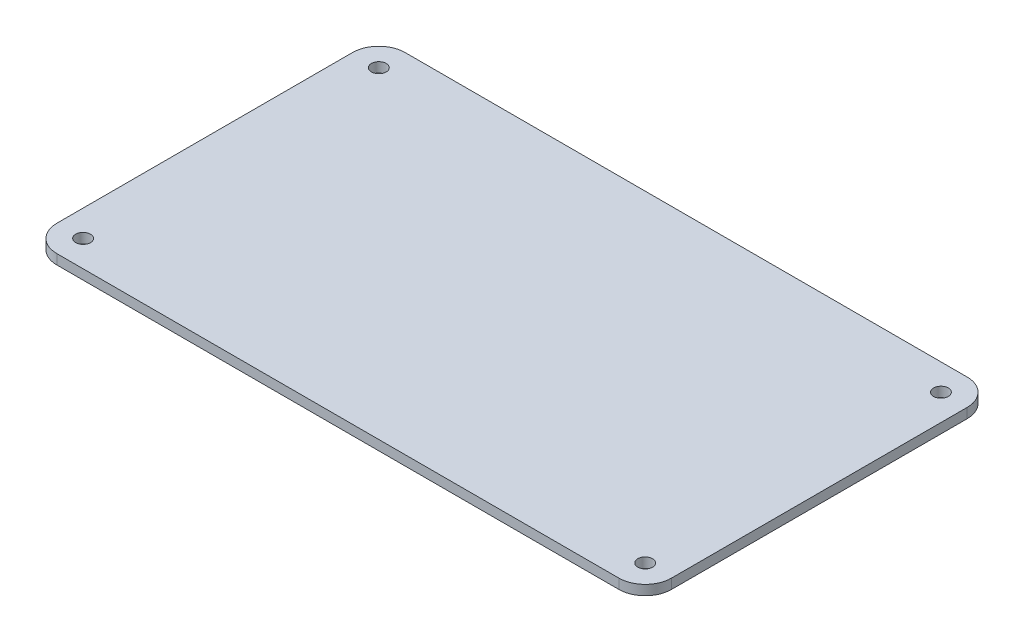
ISO-10303-21;
HEADER;
FILE_DESCRIPTION(('STEP AP214'),'2;1');
FILE_NAME('part.step','',(''),(''),'','','');
FILE_SCHEMA(('AUTOMOTIVE_DESIGN { 1 0 10303 214 1 1 1 1 }'));
ENDSEC;
DATA;
#1=APPLICATION_CONTEXT('core data for automotive mechanical design processes');
#2=APPLICATION_PROTOCOL_DEFINITION('international standard','automotive_design',2000,#1);
#3=PRODUCT_CONTEXT('',#1,'mechanical');
#4=PRODUCT('Part','Part','',(#3));
#5=PRODUCT_RELATED_PRODUCT_CATEGORY('part','',(#4));
#6=PRODUCT_DEFINITION_FORMATION('','',#4);
#7=PRODUCT_DEFINITION_CONTEXT('part definition',#1,'design');
#8=PRODUCT_DEFINITION('design','',#6,#7);
#9=PRODUCT_DEFINITION_SHAPE('','',#8);
#10=(LENGTH_UNIT() NAMED_UNIT(*) SI_UNIT(.MILLI.,.METRE.));
#11=(NAMED_UNIT(*) PLANE_ANGLE_UNIT() SI_UNIT($,.RADIAN.));
#12=(NAMED_UNIT(*) SI_UNIT($,.STERADIAN.) SOLID_ANGLE_UNIT());
#13=UNCERTAINTY_MEASURE_WITH_UNIT(LENGTH_MEASURE(1.E-05),#10,'distance_accuracy_value','');
#14=(GEOMETRIC_REPRESENTATION_CONTEXT(3) GLOBAL_UNCERTAINTY_ASSIGNED_CONTEXT((#13)) GLOBAL_UNIT_ASSIGNED_CONTEXT((#10,
#11,#12)) REPRESENTATION_CONTEXT('',''));
#15=CARTESIAN_POINT('',(0.,0.,0.));
#16=DIRECTION('',(0.,0.,1.));
#17=DIRECTION('',(1.,0.,0.));
#18=AXIS2_PLACEMENT_3D('',#15,#16,#17);
#19=CARTESIAN_POINT('',(0.,4.7625,142.88262));
#20=DIRECTION('',(0.,-1.,0.));
#21=DIRECTION('',(0.,0.,-1.));
#22=AXIS2_PLACEMENT_3D('',#19,#20,#21);
#23=CYLINDRICAL_SURFACE('',#22,12.7);
#24=CARTESIAN_POINT('',(0.,0.,142.88262));
#25=DIRECTION('',(0.,1.,0.));
#26=DIRECTION('',(0.,0.,1.));
#27=AXIS2_PLACEMENT_3D('',#24,#25,#26);
#28=CIRCLE('',#27,12.7);
#29=CARTESIAN_POINT('',(-12.7,0.,142.88262));
#30=VERTEX_POINT('',#29);
#31=CARTESIAN_POINT('',(0.,0.,155.58262));
#32=VERTEX_POINT('',#31);
#33=EDGE_CURVE('E144',#30,#32,#28,.T.);
#34=ORIENTED_EDGE('',*,*,#33,.T.);
#35=DIRECTION('',(0.,-1.,0.));
#36=VECTOR('',#35,1.);
#37=CARTESIAN_POINT('',(0.,4.7625,155.58262));
#38=LINE('',#37,#36);
#39=CARTESIAN_POINT('',(0.,4.7625,155.58262));
#40=VERTEX_POINT('',#39);
#41=EDGE_CURVE('E11',#40,#32,#38,.T.);
#42=ORIENTED_EDGE('',*,*,#41,.F.);
#43=CARTESIAN_POINT('',(0.,4.7625,142.88262));
#44=DIRECTION('',(0.,1.,0.));
#45=DIRECTION('',(0.,0.,1.));
#46=AXIS2_PLACEMENT_3D('',#43,#44,#45);
#47=CIRCLE('',#46,12.7);
#48=CARTESIAN_POINT('',(-12.7,4.7625,142.88262));
#49=VERTEX_POINT('',#48);
#50=EDGE_CURVE('E167',#49,#40,#47,.T.);
#51=ORIENTED_EDGE('',*,*,#50,.F.);
#52=DIRECTION('',(0.,-1.,0.));
#53=VECTOR('',#52,1.);
#54=CARTESIAN_POINT('',(-12.7,4.7625,142.88262));
#55=LINE('',#54,#53);
#56=EDGE_CURVE('E140',#49,#30,#55,.T.);
#57=ORIENTED_EDGE('',*,*,#56,.T.);
#58=EDGE_LOOP('',(#34,#42,#51,#57));
#59=FACE_BOUND('',#58,.T.);
#60=ADVANCED_FACE('F43',(#59),#23,.T.);
#61=CARTESIAN_POINT('',(0.,4.7625,155.58262));
#62=DIRECTION('',(0.,0.,-1.));
#63=DIRECTION('',(-1.,0.,0.));
#64=AXIS2_PLACEMENT_3D('',#61,#62,#63);
#65=PLANE('',#64);
#66=DIRECTION('',(1.,0.,0.));
#67=VECTOR('',#66,1.);
#68=CARTESIAN_POINT('',(0.,0.,155.58262));
#69=LINE('',#68,#67);
#70=CARTESIAN_POINT('',(271.58696,0.,155.58262));
#71=VERTEX_POINT('',#70);
#72=EDGE_CURVE('E148',#32,#71,#69,.T.);
#73=ORIENTED_EDGE('',*,*,#72,.T.);
#74=DIRECTION('',(0.,-1.,0.));
#75=VECTOR('',#74,1.);
#76=CARTESIAN_POINT('',(271.58696,4.7625,155.58262));
#77=LINE('',#76,#75);
#78=CARTESIAN_POINT('',(271.58696,4.7625,155.58262));
#79=VERTEX_POINT('',#78);
#80=EDGE_CURVE('E52',#79,#71,#77,.T.);
#81=ORIENTED_EDGE('',*,*,#80,.F.);
#82=DIRECTION('',(1.,0.,0.));
#83=VECTOR('',#82,1.);
#84=CARTESIAN_POINT('',(0.,4.7625,155.58262));
#85=LINE('',#84,#83);
#86=EDGE_CURVE('E103',#40,#79,#85,.T.);
#87=ORIENTED_EDGE('',*,*,#86,.F.);
#88=ORIENTED_EDGE('',*,*,#41,.T.);
#89=EDGE_LOOP('',(#73,#81,#87,#88));
#90=FACE_BOUND('',#89,.T.);
#91=ADVANCED_FACE('F271',(#90),#65,.F.);
#92=CARTESIAN_POINT('',(271.58696,4.7625,142.88262));
#93=DIRECTION('',(0.,-1.,0.));
#94=DIRECTION('',(0.,0.,-1.));
#95=AXIS2_PLACEMENT_3D('',#92,#93,#94);
#96=CYLINDRICAL_SURFACE('',#95,12.7);
#97=CARTESIAN_POINT('',(271.58696,0.,142.88262));
#98=DIRECTION('',(0.,1.,0.));
#99=DIRECTION('',(0.,0.,1.));
#100=AXIS2_PLACEMENT_3D('',#97,#98,#99);
#101=CIRCLE('',#100,12.7);
#102=CARTESIAN_POINT('',(284.28696,0.,142.88262));
#103=VERTEX_POINT('',#102);
#104=EDGE_CURVE('E152',#71,#103,#101,.T.);
#105=ORIENTED_EDGE('',*,*,#104,.T.);
#106=DIRECTION('',(0.,-1.,0.));
#107=VECTOR('',#106,1.);
#108=CARTESIAN_POINT('',(284.28696,4.7625,142.88262));
#109=LINE('',#108,#107);
#110=CARTESIAN_POINT('',(284.28696,4.7625,142.88262));
#111=VERTEX_POINT('',#110);
#112=EDGE_CURVE('E178',#111,#103,#109,.T.);
#113=ORIENTED_EDGE('',*,*,#112,.F.);
#114=CARTESIAN_POINT('',(271.58696,4.7625,142.88262));
#115=DIRECTION('',(0.,1.,0.));
#116=DIRECTION('',(0.,0.,1.));
#117=AXIS2_PLACEMENT_3D('',#114,#115,#116);
#118=CIRCLE('',#117,12.7);
#119=EDGE_CURVE('E188',#79,#111,#118,.T.);
#120=ORIENTED_EDGE('',*,*,#119,.F.);
#121=ORIENTED_EDGE('',*,*,#80,.T.);
#122=EDGE_LOOP('',(#105,#113,#120,#121));
#123=FACE_BOUND('',#122,.T.);
#124=ADVANCED_FACE('F186',(#123),#96,.T.);
#125=CARTESIAN_POINT('',(284.28696,4.7625,142.88262));
#126=DIRECTION('',(-1.,0.,0.));
#127=DIRECTION('',(0.,0.,1.));
#128=AXIS2_PLACEMENT_3D('',#125,#126,#127);
#129=PLANE('',#128);
#130=DIRECTION('',(0.,0.,-1.));
#131=VECTOR('',#130,1.);
#132=CARTESIAN_POINT('',(284.28696,0.,142.88262));
#133=LINE('',#132,#131);
#134=CARTESIAN_POINT('',(284.28696,0.,0.));
#135=VERTEX_POINT('',#134);
#136=EDGE_CURVE('E155',#103,#135,#133,.T.);
#137=ORIENTED_EDGE('',*,*,#136,.T.);
#138=DIRECTION('',(0.,-1.,0.));
#139=VECTOR('',#138,1.);
#140=CARTESIAN_POINT('',(284.28696,4.7625,0.));
#141=LINE('',#140,#139);
#142=CARTESIAN_POINT('',(284.28696,4.7625,0.));
#143=VERTEX_POINT('',#142);
#144=EDGE_CURVE('E174',#143,#135,#141,.T.);
#145=ORIENTED_EDGE('',*,*,#144,.F.);
#146=DIRECTION('',(0.,0.,-1.));
#147=VECTOR('',#146,1.);
#148=CARTESIAN_POINT('',(284.28696,4.7625,142.88262));
#149=LINE('',#148,#147);
#150=EDGE_CURVE('E201',#111,#143,#149,.T.);
#151=ORIENTED_EDGE('',*,*,#150,.F.);
#152=ORIENTED_EDGE('',*,*,#112,.T.);
#153=EDGE_LOOP('',(#137,#145,#151,#152));
#154=FACE_BOUND('',#153,.T.);
#155=ADVANCED_FACE('F196',(#154),#129,.F.);
#156=CARTESIAN_POINT('',(271.58696,4.7625,0.));
#157=DIRECTION('',(0.,-1.,0.));
#158=DIRECTION('',(0.,0.,-1.));
#159=AXIS2_PLACEMENT_3D('',#156,#157,#158);
#160=CYLINDRICAL_SURFACE('',#159,12.7);
#161=CARTESIAN_POINT('',(271.58696,0.,0.));
#162=DIRECTION('',(0.,1.,0.));
#163=DIRECTION('',(0.,0.,-1.));
#164=AXIS2_PLACEMENT_3D('',#161,#162,#163);
#165=CIRCLE('',#164,12.7);
#166=CARTESIAN_POINT('',(271.58696,0.,-12.7));
#167=VERTEX_POINT('',#166);
#168=EDGE_CURVE('E158',#135,#167,#165,.T.);
#169=ORIENTED_EDGE('',*,*,#168,.T.);
#170=DIRECTION('',(0.,-1.,0.));
#171=VECTOR('',#170,1.);
#172=CARTESIAN_POINT('',(271.58696,4.7625,-12.7));
#173=LINE('',#172,#171);
#174=CARTESIAN_POINT('',(271.58696,4.7625,-12.7));
#175=VERTEX_POINT('',#174);
#176=EDGE_CURVE('E133',#175,#167,#173,.T.);
#177=ORIENTED_EDGE('',*,*,#176,.F.);
#178=CARTESIAN_POINT('',(271.58696,4.7625,0.));
#179=DIRECTION('',(0.,1.,0.));
#180=DIRECTION('',(0.,0.,-1.));
#181=AXIS2_PLACEMENT_3D('',#178,#179,#180);
#182=CIRCLE('',#181,12.7);
#183=EDGE_CURVE('E122',#143,#175,#182,.T.);
#184=ORIENTED_EDGE('',*,*,#183,.F.);
#185=ORIENTED_EDGE('',*,*,#144,.T.);
#186=EDGE_LOOP('',(#169,#177,#184,#185));
#187=FACE_BOUND('',#186,.T.);
#188=ADVANCED_FACE('F199',(#187),#160,.T.);
#189=CARTESIAN_POINT('',(271.58696,4.7625,-12.7));
#190=DIRECTION('',(0.,0.,1.));
#191=DIRECTION('',(1.,0.,0.));
#192=AXIS2_PLACEMENT_3D('',#189,#190,#191);
#193=PLANE('',#192);
#194=DIRECTION('',(-1.,0.,0.));
#195=VECTOR('',#194,1.);
#196=CARTESIAN_POINT('',(271.58696,0.,-12.7));
#197=LINE('',#196,#195);
#198=CARTESIAN_POINT('',(0.,0.,-12.7));
#199=VERTEX_POINT('',#198);
#200=EDGE_CURVE('E131',#167,#199,#197,.T.);
#201=ORIENTED_EDGE('',*,*,#200,.T.);
#202=DIRECTION('',(0.,-1.,0.));
#203=VECTOR('',#202,1.);
#204=CARTESIAN_POINT('',(0.,4.7625,-12.7));
#205=LINE('',#204,#203);
#206=CARTESIAN_POINT('',(0.,4.7625,-12.7));
#207=VERTEX_POINT('',#206);
#208=EDGE_CURVE('E128',#207,#199,#205,.T.);
#209=ORIENTED_EDGE('',*,*,#208,.F.);
#210=DIRECTION('',(-1.,0.,0.));
#211=VECTOR('',#210,1.);
#212=CARTESIAN_POINT('',(271.58696,4.7625,-12.7));
#213=LINE('',#212,#211);
#214=EDGE_CURVE('E116',#175,#207,#213,.T.);
#215=ORIENTED_EDGE('',*,*,#214,.F.);
#216=ORIENTED_EDGE('',*,*,#176,.T.);
#217=EDGE_LOOP('',(#201,#209,#215,#216));
#218=FACE_BOUND('',#217,.T.);
#219=ADVANCED_FACE('F129',(#218),#193,.F.);
#220=CARTESIAN_POINT('',(0.,4.7625,0.));
#221=DIRECTION('',(0.,-1.,0.));
#222=DIRECTION('',(0.,0.,-1.));
#223=AXIS2_PLACEMENT_3D('',#220,#221,#222);
#224=CYLINDRICAL_SURFACE('',#223,12.7);
#225=CARTESIAN_POINT('',(0.,0.,0.));
#226=DIRECTION('',(0.,1.,0.));
#227=DIRECTION('',(0.,0.,1.));
#228=AXIS2_PLACEMENT_3D('',#225,#226,#227);
#229=CIRCLE('',#228,12.7);
#230=CARTESIAN_POINT('',(-12.7,0.,0.));
#231=VERTEX_POINT('',#230);
#232=EDGE_CURVE('E89',#199,#231,#229,.T.);
#233=ORIENTED_EDGE('',*,*,#232,.T.);
#234=DIRECTION('',(0.,-1.,0.));
#235=VECTOR('',#234,1.);
#236=CARTESIAN_POINT('',(-12.7,4.7625,0.));
#237=LINE('',#236,#235);
#238=CARTESIAN_POINT('',(-12.7,4.7625,0.));
#239=VERTEX_POINT('',#238);
#240=EDGE_CURVE('E134',#239,#231,#237,.T.);
#241=ORIENTED_EDGE('',*,*,#240,.F.);
#242=CARTESIAN_POINT('',(0.,4.7625,0.));
#243=DIRECTION('',(0.,1.,0.));
#244=DIRECTION('',(0.,0.,1.));
#245=AXIS2_PLACEMENT_3D('',#242,#243,#244);
#246=CIRCLE('',#245,12.7);
#247=EDGE_CURVE('E120',#207,#239,#246,.T.);
#248=ORIENTED_EDGE('',*,*,#247,.F.);
#249=ORIENTED_EDGE('',*,*,#208,.T.);
#250=EDGE_LOOP('',(#233,#241,#248,#249));
#251=FACE_BOUND('',#250,.T.);
#252=ADVANCED_FACE('F136',(#251),#224,.T.);
#253=CARTESIAN_POINT('',(-12.7,4.7625,0.));
#254=DIRECTION('',(1.,0.,0.));
#255=DIRECTION('',(0.,0.,-1.));
#256=AXIS2_PLACEMENT_3D('',#253,#254,#255);
#257=PLANE('',#256);
#258=DIRECTION('',(0.,0.,1.));
#259=VECTOR('',#258,1.);
#260=CARTESIAN_POINT('',(-12.7,0.,0.));
#261=LINE('',#260,#259);
#262=EDGE_CURVE('E95',#231,#30,#261,.T.);
#263=ORIENTED_EDGE('',*,*,#262,.T.);
#264=ORIENTED_EDGE('',*,*,#56,.F.);
#265=DIRECTION('',(0.,0.,1.));
#266=VECTOR('',#265,1.);
#267=CARTESIAN_POINT('',(-12.7,4.7625,0.));
#268=LINE('',#267,#266);
#269=EDGE_CURVE('E60',#239,#49,#268,.T.);
#270=ORIENTED_EDGE('',*,*,#269,.F.);
#271=ORIENTED_EDGE('',*,*,#240,.T.);
#272=EDGE_LOOP('',(#263,#264,#270,#271));
#273=FACE_BOUND('',#272,.T.);
#274=ADVANCED_FACE('F247',(#273),#257,.F.);
#275=CARTESIAN_POINT('',(0.,4.7625,142.88262));
#276=DIRECTION('',(0.,1.,0.));
#277=DIRECTION('',(0.,0.,1.));
#278=AXIS2_PLACEMENT_3D('',#275,#276,#277);
#279=PLANE('',#278);
#280=CARTESIAN_POINT('',(0.,4.7625,0.));
#281=DIRECTION('',(0.,1.,0.));
#282=DIRECTION('',(0.,0.,1.));
#283=AXIS2_PLACEMENT_3D('',#280,#281,#282);
#284=CIRCLE('',#283,3.57124);
#285=CARTESIAN_POINT('',(0.,4.7625,3.57124));
#286=VERTEX_POINT('',#285);
#287=EDGE_CURVE('E238',#286,#286,#284,.T.);
#288=ORIENTED_EDGE('',*,*,#287,.F.);
#289=EDGE_LOOP('',(#288));
#290=FACE_BOUND('',#289,.T.);
#291=CARTESIAN_POINT('',(0.,4.7625,142.88262));
#292=DIRECTION('',(0.,1.,0.));
#293=DIRECTION('',(0.,0.,1.));
#294=AXIS2_PLACEMENT_3D('',#291,#292,#293);
#295=CIRCLE('',#294,3.57124);
#296=CARTESIAN_POINT('',(0.,4.7625,146.45386));
#297=VERTEX_POINT('',#296);
#298=EDGE_CURVE('E230',#297,#297,#295,.T.);
#299=ORIENTED_EDGE('',*,*,#298,.F.);
#300=EDGE_LOOP('',(#299));
#301=FACE_BOUND('',#300,.T.);
#302=CARTESIAN_POINT('',(271.58696,4.7625,142.88262));
#303=DIRECTION('',(0.,1.,0.));
#304=DIRECTION('',(0.,0.,1.));
#305=AXIS2_PLACEMENT_3D('',#302,#303,#304);
#306=CIRCLE('',#305,3.57123999999998);
#307=CARTESIAN_POINT('',(271.58696,4.7625,146.45386));
#308=VERTEX_POINT('',#307);
#309=EDGE_CURVE('E222',#308,#308,#306,.T.);
#310=ORIENTED_EDGE('',*,*,#309,.F.);
#311=EDGE_LOOP('',(#310));
#312=FACE_BOUND('',#311,.T.);
#313=CARTESIAN_POINT('',(271.58696,4.7625,0.));
#314=DIRECTION('',(0.,1.,0.));
#315=DIRECTION('',(0.,0.,1.));
#316=AXIS2_PLACEMENT_3D('',#313,#314,#315);
#317=CIRCLE('',#316,3.57123999999998);
#318=CARTESIAN_POINT('',(271.58696,4.7625,3.57123999999998));
#319=VERTEX_POINT('',#318);
#320=EDGE_CURVE('E214',#319,#319,#317,.T.);
#321=ORIENTED_EDGE('',*,*,#320,.F.);
#322=EDGE_LOOP('',(#321));
#323=FACE_BOUND('',#322,.T.);
#324=ORIENTED_EDGE('',*,*,#50,.T.);
#325=ORIENTED_EDGE('',*,*,#86,.T.);
#326=ORIENTED_EDGE('',*,*,#119,.T.);
#327=ORIENTED_EDGE('',*,*,#150,.T.);
#328=ORIENTED_EDGE('',*,*,#183,.T.);
#329=ORIENTED_EDGE('',*,*,#214,.T.);
#330=ORIENTED_EDGE('',*,*,#247,.T.);
#331=ORIENTED_EDGE('',*,*,#269,.T.);
#332=EDGE_LOOP('',(#324,#325,#326,#327,#328,#329,#330,#331));
#333=FACE_BOUND('',#332,.T.);
#334=ADVANCED_FACE('F118',(#290,#301,#312,#323,#333),#279,.T.);
#335=CARTESIAN_POINT('',(0.,0.,142.88262));
#336=DIRECTION('',(0.,1.,0.));
#337=DIRECTION('',(0.,0.,1.));
#338=AXIS2_PLACEMENT_3D('',#335,#336,#337);
#339=PLANE('',#338);
#340=CARTESIAN_POINT('',(0.,0.,0.));
#341=DIRECTION('',(0.,1.,0.));
#342=DIRECTION('',(0.,0.,1.));
#343=AXIS2_PLACEMENT_3D('',#340,#341,#342);
#344=CIRCLE('',#343,3.57124);
#345=CARTESIAN_POINT('',(0.,0.,3.57124));
#346=VERTEX_POINT('',#345);
#347=EDGE_CURVE('E234',#346,#346,#344,.T.);
#348=ORIENTED_EDGE('',*,*,#347,.T.);
#349=EDGE_LOOP('',(#348));
#350=FACE_BOUND('',#349,.T.);
#351=CARTESIAN_POINT('',(0.,0.,142.88262));
#352=DIRECTION('',(0.,1.,0.));
#353=DIRECTION('',(0.,0.,1.));
#354=AXIS2_PLACEMENT_3D('',#351,#352,#353);
#355=CIRCLE('',#354,3.57124);
#356=CARTESIAN_POINT('',(0.,0.,146.45386));
#357=VERTEX_POINT('',#356);
#358=EDGE_CURVE('E226',#357,#357,#355,.T.);
#359=ORIENTED_EDGE('',*,*,#358,.T.);
#360=EDGE_LOOP('',(#359));
#361=FACE_BOUND('',#360,.T.);
#362=CARTESIAN_POINT('',(271.58696,0.,142.88262));
#363=DIRECTION('',(0.,1.,0.));
#364=DIRECTION('',(0.,0.,1.));
#365=AXIS2_PLACEMENT_3D('',#362,#363,#364);
#366=CIRCLE('',#365,3.57123999999998);
#367=CARTESIAN_POINT('',(271.58696,0.,146.45386));
#368=VERTEX_POINT('',#367);
#369=EDGE_CURVE('E218',#368,#368,#366,.T.);
#370=ORIENTED_EDGE('',*,*,#369,.T.);
#371=EDGE_LOOP('',(#370));
#372=FACE_BOUND('',#371,.T.);
#373=CARTESIAN_POINT('',(271.58696,0.,0.));
#374=DIRECTION('',(0.,1.,0.));
#375=DIRECTION('',(0.,0.,1.));
#376=AXIS2_PLACEMENT_3D('',#373,#374,#375);
#377=CIRCLE('',#376,3.57123999999998);
#378=CARTESIAN_POINT('',(271.58696,0.,3.57123999999998));
#379=VERTEX_POINT('',#378);
#380=EDGE_CURVE('E149',#379,#379,#377,.T.);
#381=ORIENTED_EDGE('',*,*,#380,.T.);
#382=EDGE_LOOP('',(#381));
#383=FACE_BOUND('',#382,.T.);
#384=ORIENTED_EDGE('',*,*,#33,.F.);
#385=ORIENTED_EDGE('',*,*,#262,.F.);
#386=ORIENTED_EDGE('',*,*,#232,.F.);
#387=ORIENTED_EDGE('',*,*,#200,.F.);
#388=ORIENTED_EDGE('',*,*,#168,.F.);
#389=ORIENTED_EDGE('',*,*,#136,.F.);
#390=ORIENTED_EDGE('',*,*,#104,.F.);
#391=ORIENTED_EDGE('',*,*,#72,.F.);
#392=EDGE_LOOP('',(#384,#385,#386,#387,#388,#389,#390,#391));
#393=FACE_BOUND('',#392,.T.);
#394=ADVANCED_FACE('F192',(#350,#361,#372,#383,#393),#339,.F.);
#395=CARTESIAN_POINT('',(271.58696,4.7625,0.));
#396=DIRECTION('',(0.,1.,0.));
#397=DIRECTION('',(0.,0.,1.));
#398=AXIS2_PLACEMENT_3D('',#395,#396,#397);
#399=CYLINDRICAL_SURFACE('',#398,3.57123999999998);
#400=ORIENTED_EDGE('',*,*,#380,.F.);
#401=EDGE_LOOP('',(#400));
#402=FACE_BOUND('',#401,.T.);
#403=ORIENTED_EDGE('',*,*,#320,.T.);
#404=EDGE_LOOP('',(#403));
#405=FACE_BOUND('',#404,.T.);
#406=ADVANCED_FACE('F255',(#402,#405),#399,.F.);
#407=CARTESIAN_POINT('',(271.58696,4.7625,142.88262));
#408=DIRECTION('',(0.,1.,0.));
#409=DIRECTION('',(0.,0.,1.));
#410=AXIS2_PLACEMENT_3D('',#407,#408,#409);
#411=CYLINDRICAL_SURFACE('',#410,3.57123999999998);
#412=ORIENTED_EDGE('',*,*,#369,.F.);
#413=EDGE_LOOP('',(#412));
#414=FACE_BOUND('',#413,.T.);
#415=ORIENTED_EDGE('',*,*,#309,.T.);
#416=EDGE_LOOP('',(#415));
#417=FACE_BOUND('',#416,.T.);
#418=ADVANCED_FACE('F257',(#414,#417),#411,.F.);
#419=CARTESIAN_POINT('',(0.,4.7625,142.88262));
#420=DIRECTION('',(0.,1.,0.));
#421=DIRECTION('',(0.,0.,1.));
#422=AXIS2_PLACEMENT_3D('',#419,#420,#421);
#423=CYLINDRICAL_SURFACE('',#422,3.57124);
#424=ORIENTED_EDGE('',*,*,#358,.F.);
#425=EDGE_LOOP('',(#424));
#426=FACE_BOUND('',#425,.T.);
#427=ORIENTED_EDGE('',*,*,#298,.T.);
#428=EDGE_LOOP('',(#427));
#429=FACE_BOUND('',#428,.T.);
#430=ADVANCED_FACE('F264',(#426,#429),#423,.F.);
#431=CARTESIAN_POINT('',(0.,4.7625,0.));
#432=DIRECTION('',(0.,1.,0.));
#433=DIRECTION('',(0.,0.,1.));
#434=AXIS2_PLACEMENT_3D('',#431,#432,#433);
#435=CYLINDRICAL_SURFACE('',#434,3.57124);
#436=ORIENTED_EDGE('',*,*,#347,.F.);
#437=EDGE_LOOP('',(#436));
#438=FACE_BOUND('',#437,.T.);
#439=ORIENTED_EDGE('',*,*,#287,.T.);
#440=EDGE_LOOP('',(#439));
#441=FACE_BOUND('',#440,.T.);
#442=ADVANCED_FACE('F243',(#438,#441),#435,.F.);
#443=CLOSED_SHELL('',(#60,#91,#124,#155,#188,#219,#252,#274,#334,#394,#406,#418,#430,#442));
#444=MANIFOLD_SOLID_BREP('B2',#443);
#445=ADVANCED_BREP_SHAPE_REPRESENTATION('',(#18,#444),#14);
#446=SHAPE_DEFINITION_REPRESENTATION(#9,#445);
ENDSEC;
END-ISO-10303-21;
